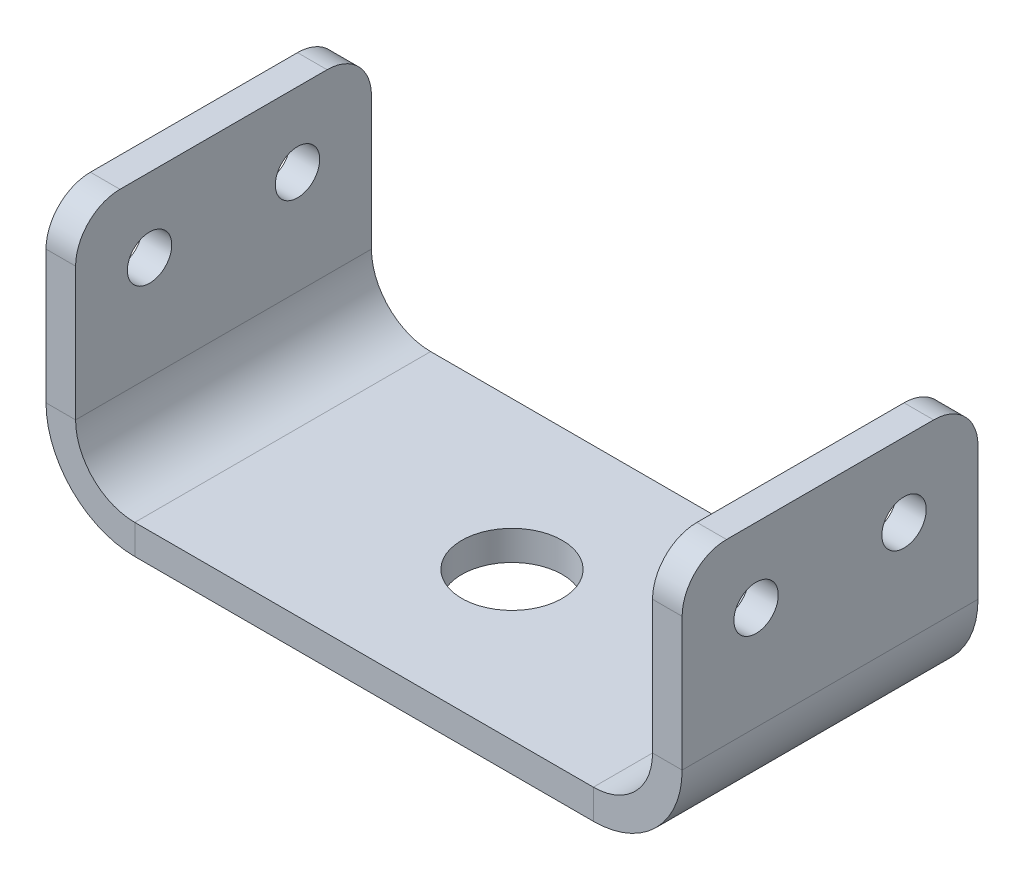
ISO-10303-21;
HEADER;
FILE_DESCRIPTION(('STEP AP214'),'2;1');
FILE_NAME('part.step','',(''),(''),'','','');
FILE_SCHEMA(('AUTOMOTIVE_DESIGN { 1 0 10303 214 1 1 1 1 }'));
ENDSEC;
DATA;
#1=APPLICATION_CONTEXT('core data for automotive mechanical design processes');
#2=APPLICATION_PROTOCOL_DEFINITION('international standard','automotive_design',2000,#1);
#3=PRODUCT_CONTEXT('',#1,'mechanical');
#4=PRODUCT('Part','Part','',(#3));
#5=PRODUCT_RELATED_PRODUCT_CATEGORY('part','',(#4));
#6=PRODUCT_DEFINITION_FORMATION('','',#4);
#7=PRODUCT_DEFINITION_CONTEXT('part definition',#1,'design');
#8=PRODUCT_DEFINITION('design','',#6,#7);
#9=PRODUCT_DEFINITION_SHAPE('','',#8);
#10=(LENGTH_UNIT() NAMED_UNIT(*) SI_UNIT(.MILLI.,.METRE.));
#11=(NAMED_UNIT(*) PLANE_ANGLE_UNIT() SI_UNIT($,.RADIAN.));
#12=(NAMED_UNIT(*) SI_UNIT($,.STERADIAN.) SOLID_ANGLE_UNIT());
#13=UNCERTAINTY_MEASURE_WITH_UNIT(LENGTH_MEASURE(1.E-05),#10,'distance_accuracy_value','');
#14=(GEOMETRIC_REPRESENTATION_CONTEXT(3) GLOBAL_UNCERTAINTY_ASSIGNED_CONTEXT((#13)) GLOBAL_UNIT_ASSIGNED_CONTEXT((#10,
#11,#12)) REPRESENTATION_CONTEXT('',''));
#15=CARTESIAN_POINT('',(0.,0.,0.));
#16=DIRECTION('',(0.,0.,1.));
#17=DIRECTION('',(1.,0.,0.));
#18=AXIS2_PLACEMENT_3D('',#15,#16,#17);
#19=CARTESIAN_POINT('',(21.5,-6.,-10.));
#20=DIRECTION('',(0.,1.,0.));
#21=DIRECTION('',(0.,0.,1.));
#22=AXIS2_PLACEMENT_3D('',#19,#20,#21);
#23=PLANE('',#22);
#24=DIRECTION('',(-1.,0.,0.));
#25=VECTOR('',#24,1.);
#26=CARTESIAN_POINT('',(21.5,-6.,10.));
#27=LINE('',#26,#25);
#28=CARTESIAN_POINT('',(15.5,-6.,10.));
#29=VERTEX_POINT('',#28);
#30=CARTESIAN_POINT('',(-15.5,-6.,10.));
#31=VERTEX_POINT('',#30);
#32=EDGE_CURVE('E129',#29,#31,#27,.T.);
#33=ORIENTED_EDGE('',*,*,#32,.T.);
#34=DIRECTION('',(0.,0.,-1.));
#35=VECTOR('',#34,1.);
#36=CARTESIAN_POINT('',(-15.5,-6.,-10.));
#37=LINE('',#36,#35);
#38=CARTESIAN_POINT('',(-15.5,-6.,-10.));
#39=VERTEX_POINT('',#38);
#40=EDGE_CURVE('E222',#31,#39,#37,.T.);
#41=ORIENTED_EDGE('',*,*,#40,.T.);
#42=DIRECTION('',(-1.,0.,0.));
#43=VECTOR('',#42,1.);
#44=CARTESIAN_POINT('',(21.5,-6.,-10.));
#45=LINE('',#44,#43);
#46=CARTESIAN_POINT('',(15.5,-6.,-10.));
#47=VERTEX_POINT('',#46);
#48=EDGE_CURVE('E338',#47,#39,#45,.T.);
#49=ORIENTED_EDGE('',*,*,#48,.F.);
#50=DIRECTION('',(0.,0.,-1.));
#51=VECTOR('',#50,1.);
#52=CARTESIAN_POINT('',(15.5,-6.,-10.));
#53=LINE('',#52,#51);
#54=EDGE_CURVE('E229',#47,#29,#53,.F.);
#55=ORIENTED_EDGE('',*,*,#54,.T.);
#56=EDGE_LOOP('',(#33,#41,#49,#55));
#57=FACE_BOUND('',#56,.T.);
#58=CARTESIAN_POINT('',(0.,-6.,0.));
#59=DIRECTION('',(0.,1.,0.));
#60=DIRECTION('',(0.,0.,1.));
#61=AXIS2_PLACEMENT_3D('',#58,#59,#60);
#62=CIRCLE('',#61,4.76488561011312);
#63=CARTESIAN_POINT('',(0.,-6.,4.76488561011311));
#64=VERTEX_POINT('',#63);
#65=EDGE_CURVE('E11',#64,#64,#62,.F.);
#66=ORIENTED_EDGE('',*,*,#65,.F.);
#67=EDGE_LOOP('',(#66));
#68=FACE_BOUND('',#67,.T.);
#69=ADVANCED_FACE('F50',(#57,#68),#23,.F.);
#70=CARTESIAN_POINT('',(21.5,-6.,10.));
#71=DIRECTION('',(0.,0.,-1.));
#72=DIRECTION('',(-1.,0.,0.));
#73=AXIS2_PLACEMENT_3D('',#70,#71,#72);
#74=PLANE('',#73);
#75=DIRECTION('',(0.,-1.,0.));
#76=VECTOR('',#75,1.);
#77=CARTESIAN_POINT('',(15.5,-6.,10.));
#78=LINE('',#77,#76);
#79=CARTESIAN_POINT('',(15.5,-4.,10.));
#80=VERTEX_POINT('',#79);
#81=EDGE_CURVE('E60',#80,#29,#78,.T.);
#82=ORIENTED_EDGE('',*,*,#81,.F.);
#83=DIRECTION('',(1.,0.,0.));
#84=VECTOR('',#83,1.);
#85=CARTESIAN_POINT('',(21.5,-4.,10.));
#86=LINE('',#85,#84);
#87=CARTESIAN_POINT('',(-15.5,-4.,10.));
#88=VERTEX_POINT('',#87);
#89=EDGE_CURVE('E126',#80,#88,#86,.F.);
#90=ORIENTED_EDGE('',*,*,#89,.T.);
#91=DIRECTION('',(0.,-1.,0.));
#92=VECTOR('',#91,1.);
#93=CARTESIAN_POINT('',(-15.5,-6.,10.));
#94=LINE('',#93,#92);
#95=EDGE_CURVE('E135',#88,#31,#94,.T.);
#96=ORIENTED_EDGE('',*,*,#95,.T.);
#97=ORIENTED_EDGE('',*,*,#32,.F.);
#98=EDGE_LOOP('',(#82,#90,#96,#97));
#99=FACE_BOUND('',#98,.T.);
#100=ADVANCED_FACE('F123',(#99),#74,.F.);
#101=CARTESIAN_POINT('',(-15.5,0.,10.));
#102=DIRECTION('',(0.,0.,1.));
#103=DIRECTION('',(1.,0.,0.));
#104=AXIS2_PLACEMENT_3D('',#101,#102,#103);
#105=PLANE('',#104);
#106=ORIENTED_EDGE('',*,*,#95,.F.);
#107=CARTESIAN_POINT('',(-15.5,0.,10.));
#108=DIRECTION('',(0.,0.,1.));
#109=DIRECTION('',(0.,-1.,0.));
#110=AXIS2_PLACEMENT_3D('',#107,#108,#109);
#111=CIRCLE('',#110,4.);
#112=CARTESIAN_POINT('',(-19.5,0.,10.));
#113=VERTEX_POINT('',#112);
#114=EDGE_CURVE('E170',#88,#113,#111,.F.);
#115=ORIENTED_EDGE('',*,*,#114,.T.);
#116=DIRECTION('',(-1.,0.,0.));
#117=VECTOR('',#116,1.);
#118=CARTESIAN_POINT('',(-21.5,0.,10.));
#119=LINE('',#118,#117);
#120=CARTESIAN_POINT('',(-21.5,0.,10.));
#121=VERTEX_POINT('',#120);
#122=EDGE_CURVE('E68',#113,#121,#119,.T.);
#123=ORIENTED_EDGE('',*,*,#122,.T.);
#124=CARTESIAN_POINT('',(-15.5,0.,10.));
#125=DIRECTION('',(0.,0.,-1.));
#126=DIRECTION('',(-1.,0.,0.));
#127=AXIS2_PLACEMENT_3D('',#124,#125,#126);
#128=CIRCLE('',#127,6.);
#129=EDGE_CURVE('E236',#31,#121,#128,.T.);
#130=ORIENTED_EDGE('',*,*,#129,.F.);
#131=EDGE_LOOP('',(#106,#115,#123,#130));
#132=FACE_BOUND('',#131,.T.);
#133=ADVANCED_FACE('F281',(#132),#105,.T.);
#134=CARTESIAN_POINT('',(-21.5,0.,10.));
#135=DIRECTION('',(0.,0.,-1.));
#136=DIRECTION('',(0.,-1.,0.));
#137=AXIS2_PLACEMENT_3D('',#134,#135,#136);
#138=PLANE('',#137);
#139=ORIENTED_EDGE('',*,*,#122,.F.);
#140=DIRECTION('',(0.,1.,0.));
#141=VECTOR('',#140,1.);
#142=CARTESIAN_POINT('',(-19.5,0.,10.));
#143=LINE('',#142,#141);
#144=CARTESIAN_POINT('',(-19.5,9.,10.));
#145=VERTEX_POINT('',#144);
#146=EDGE_CURVE('E272',#145,#113,#143,.F.);
#147=ORIENTED_EDGE('',*,*,#146,.F.);
#148=DIRECTION('',(-1.,0.,0.));
#149=VECTOR('',#148,1.);
#150=CARTESIAN_POINT('',(-21.5,9.,10.));
#151=LINE('',#150,#149);
#152=CARTESIAN_POINT('',(-21.5,9.,10.));
#153=VERTEX_POINT('',#152);
#154=EDGE_CURVE('E212',#145,#153,#151,.T.);
#155=ORIENTED_EDGE('',*,*,#154,.T.);
#156=DIRECTION('',(0.,-1.,0.));
#157=VECTOR('',#156,1.);
#158=CARTESIAN_POINT('',(-21.5,0.,10.));
#159=LINE('',#158,#157);
#160=EDGE_CURVE('E295',#153,#121,#159,.T.);
#161=ORIENTED_EDGE('',*,*,#160,.T.);
#162=EDGE_LOOP('',(#139,#147,#155,#161));
#163=FACE_BOUND('',#162,.T.);
#164=ADVANCED_FACE('F292',(#163),#138,.F.);
#165=CARTESIAN_POINT('',(-21.5,9.,7.));
#166=DIRECTION('',(-1.,0.,0.));
#167=DIRECTION('',(0.,0.,1.));
#168=AXIS2_PLACEMENT_3D('',#165,#166,#167);
#169=CYLINDRICAL_SURFACE('',#168,3.);
#170=ORIENTED_EDGE('',*,*,#154,.F.);
#171=CARTESIAN_POINT('',(-19.5,9.,7.));
#172=DIRECTION('',(-1.,0.,0.));
#173=DIRECTION('',(0.,0.,1.));
#174=AXIS2_PLACEMENT_3D('',#171,#172,#173);
#175=CIRCLE('',#174,3.);
#176=CARTESIAN_POINT('',(-19.5,12.,7.));
#177=VERTEX_POINT('',#176);
#178=EDGE_CURVE('E249',#145,#177,#175,.T.);
#179=ORIENTED_EDGE('',*,*,#178,.T.);
#180=DIRECTION('',(-1.,0.,0.));
#181=VECTOR('',#180,1.);
#182=CARTESIAN_POINT('',(-21.5,12.,7.));
#183=LINE('',#182,#181);
#184=CARTESIAN_POINT('',(-21.5,12.,7.));
#185=VERTEX_POINT('',#184);
#186=EDGE_CURVE('E209',#177,#185,#183,.T.);
#187=ORIENTED_EDGE('',*,*,#186,.T.);
#188=CARTESIAN_POINT('',(-21.5,9.,7.));
#189=DIRECTION('',(-1.,0.,0.));
#190=DIRECTION('',(0.,0.,1.));
#191=AXIS2_PLACEMENT_3D('',#188,#189,#190);
#192=CIRCLE('',#191,3.);
#193=EDGE_CURVE('E298',#153,#185,#192,.T.);
#194=ORIENTED_EDGE('',*,*,#193,.F.);
#195=EDGE_LOOP('',(#170,#179,#187,#194));
#196=FACE_BOUND('',#195,.T.);
#197=ADVANCED_FACE('F395',(#196),#169,.T.);
#198=CARTESIAN_POINT('',(-21.5,12.,-10.));
#199=DIRECTION('',(0.,-1.,0.));
#200=DIRECTION('',(0.,0.,1.));
#201=AXIS2_PLACEMENT_3D('',#198,#199,#200);
#202=PLANE('',#201);
#203=ORIENTED_EDGE('',*,*,#186,.F.);
#204=DIRECTION('',(0.,0.,1.));
#205=VECTOR('',#204,1.);
#206=CARTESIAN_POINT('',(-19.5,12.,0.));
#207=LINE('',#206,#205);
#208=CARTESIAN_POINT('',(-19.5,12.,-6.99999999999999));
#209=VERTEX_POINT('',#208);
#210=EDGE_CURVE('E179',#209,#177,#207,.T.);
#211=ORIENTED_EDGE('',*,*,#210,.F.);
#212=DIRECTION('',(-1.,0.,0.));
#213=VECTOR('',#212,1.);
#214=CARTESIAN_POINT('',(-21.5,12.,-6.99999999999999));
#215=LINE('',#214,#213);
#216=CARTESIAN_POINT('',(-21.5,12.,-6.99999999999999));
#217=VERTEX_POINT('',#216);
#218=EDGE_CURVE('E206',#209,#217,#215,.T.);
#219=ORIENTED_EDGE('',*,*,#218,.T.);
#220=DIRECTION('',(0.,0.,1.));
#221=VECTOR('',#220,1.);
#222=CARTESIAN_POINT('',(-21.5,12.,-10.));
#223=LINE('',#222,#221);
#224=EDGE_CURVE('E352',#217,#185,#223,.T.);
#225=ORIENTED_EDGE('',*,*,#224,.T.);
#226=EDGE_LOOP('',(#203,#211,#219,#225));
#227=FACE_BOUND('',#226,.T.);
#228=ADVANCED_FACE('F391',(#227),#202,.F.);
#229=CARTESIAN_POINT('',(-21.5,9.,-6.99999999999999));
#230=DIRECTION('',(-1.,0.,0.));
#231=DIRECTION('',(0.,0.,1.));
#232=AXIS2_PLACEMENT_3D('',#229,#230,#231);
#233=CYLINDRICAL_SURFACE('',#232,3.);
#234=ORIENTED_EDGE('',*,*,#218,.F.);
#235=CARTESIAN_POINT('',(-19.5,9.,-6.99999999999999));
#236=DIRECTION('',(-1.,0.,0.));
#237=DIRECTION('',(0.,0.,1.));
#238=AXIS2_PLACEMENT_3D('',#235,#236,#237);
#239=CIRCLE('',#238,3.);
#240=CARTESIAN_POINT('',(-19.5,9.,-9.99999999999999));
#241=VERTEX_POINT('',#240);
#242=EDGE_CURVE('E273',#209,#241,#239,.T.);
#243=ORIENTED_EDGE('',*,*,#242,.T.);
#244=DIRECTION('',(-1.,0.,0.));
#245=VECTOR('',#244,1.);
#246=CARTESIAN_POINT('',(-21.5,9.,-9.99999999999999));
#247=LINE('',#246,#245);
#248=CARTESIAN_POINT('',(-21.5,9.,-9.99999999999999));
#249=VERTEX_POINT('',#248);
#250=EDGE_CURVE('E203',#241,#249,#247,.T.);
#251=ORIENTED_EDGE('',*,*,#250,.T.);
#252=CARTESIAN_POINT('',(-21.5,9.,-6.99999999999999));
#253=DIRECTION('',(-1.,0.,0.));
#254=DIRECTION('',(0.,0.,1.));
#255=AXIS2_PLACEMENT_3D('',#252,#253,#254);
#256=CIRCLE('',#255,3.);
#257=EDGE_CURVE('E304',#217,#249,#256,.T.);
#258=ORIENTED_EDGE('',*,*,#257,.F.);
#259=EDGE_LOOP('',(#234,#243,#251,#258));
#260=FACE_BOUND('',#259,.T.);
#261=ADVANCED_FACE('F393',(#260),#233,.T.);
#262=CARTESIAN_POINT('',(-21.5,0.,-10.));
#263=DIRECTION('',(0.,0.,1.));
#264=DIRECTION('',(0.,1.,0.));
#265=AXIS2_PLACEMENT_3D('',#262,#263,#264);
#266=PLANE('',#265);
#267=ORIENTED_EDGE('',*,*,#250,.F.);
#268=DIRECTION('',(0.,1.,0.));
#269=VECTOR('',#268,1.);
#270=CARTESIAN_POINT('',(-19.5,0.,-10.));
#271=LINE('',#270,#269);
#272=CARTESIAN_POINT('',(-19.5,0.,-10.));
#273=VERTEX_POINT('',#272);
#274=EDGE_CURVE('E269',#273,#241,#271,.T.);
#275=ORIENTED_EDGE('',*,*,#274,.F.);
#276=DIRECTION('',(-1.,0.,0.));
#277=VECTOR('',#276,1.);
#278=CARTESIAN_POINT('',(-21.5,0.,-10.));
#279=LINE('',#278,#277);
#280=CARTESIAN_POINT('',(-21.5,0.,-10.));
#281=VERTEX_POINT('',#280);
#282=EDGE_CURVE('E201',#273,#281,#279,.T.);
#283=ORIENTED_EDGE('',*,*,#282,.T.);
#284=DIRECTION('',(0.,1.,0.));
#285=VECTOR('',#284,1.);
#286=CARTESIAN_POINT('',(-21.5,0.,-10.));
#287=LINE('',#286,#285);
#288=EDGE_CURVE('E299',#281,#249,#287,.T.);
#289=ORIENTED_EDGE('',*,*,#288,.T.);
#290=EDGE_LOOP('',(#267,#275,#283,#289));
#291=FACE_BOUND('',#290,.T.);
#292=ADVANCED_FACE('F363',(#291),#266,.F.);
#293=CARTESIAN_POINT('',(-15.5,0.,-10.));
#294=DIRECTION('',(0.,0.,1.));
#295=DIRECTION('',(0.,-1.,0.));
#296=AXIS2_PLACEMENT_3D('',#293,#294,#295);
#297=PLANE('',#296);
#298=ORIENTED_EDGE('',*,*,#282,.F.);
#299=CARTESIAN_POINT('',(-15.5,0.,-10.));
#300=DIRECTION('',(0.,0.,1.));
#301=DIRECTION('',(0.,-1.,0.));
#302=AXIS2_PLACEMENT_3D('',#299,#300,#301);
#303=CIRCLE('',#302,4.);
#304=CARTESIAN_POINT('',(-15.5,-4.,-10.));
#305=VERTEX_POINT('',#304);
#306=EDGE_CURVE('E266',#273,#305,#303,.T.);
#307=ORIENTED_EDGE('',*,*,#306,.T.);
#308=DIRECTION('',(0.,-1.,0.));
#309=VECTOR('',#308,1.);
#310=CARTESIAN_POINT('',(-15.5,-6.,-10.));
#311=LINE('',#310,#309);
#312=EDGE_CURVE('E198',#305,#39,#311,.T.);
#313=ORIENTED_EDGE('',*,*,#312,.T.);
#314=CARTESIAN_POINT('',(-15.5,0.,-10.));
#315=DIRECTION('',(0.,0.,-1.));
#316=DIRECTION('',(0.,1.,0.));
#317=AXIS2_PLACEMENT_3D('',#314,#315,#316);
#318=CIRCLE('',#317,6.);
#319=EDGE_CURVE('E233',#281,#39,#318,.F.);
#320=ORIENTED_EDGE('',*,*,#319,.F.);
#321=EDGE_LOOP('',(#298,#307,#313,#320));
#322=FACE_BOUND('',#321,.T.);
#323=ADVANCED_FACE('F365',(#322),#297,.F.);
#324=CARTESIAN_POINT('',(21.5,-6.,-10.));
#325=DIRECTION('',(0.,0.,-1.));
#326=DIRECTION('',(-1.,0.,0.));
#327=AXIS2_PLACEMENT_3D('',#324,#325,#326);
#328=PLANE('',#327);
#329=ORIENTED_EDGE('',*,*,#312,.F.);
#330=DIRECTION('',(1.,0.,0.));
#331=VECTOR('',#330,1.);
#332=CARTESIAN_POINT('',(21.5,-4.,-10.));
#333=LINE('',#332,#331);
#334=CARTESIAN_POINT('',(15.5,-4.,-10.));
#335=VERTEX_POINT('',#334);
#336=EDGE_CURVE('E159',#335,#305,#333,.F.);
#337=ORIENTED_EDGE('',*,*,#336,.F.);
#338=DIRECTION('',(0.,-1.,0.));
#339=VECTOR('',#338,1.);
#340=CARTESIAN_POINT('',(15.5,-6.,-10.));
#341=LINE('',#340,#339);
#342=EDGE_CURVE('E195',#335,#47,#341,.T.);
#343=ORIENTED_EDGE('',*,*,#342,.T.);
#344=ORIENTED_EDGE('',*,*,#48,.T.);
#345=EDGE_LOOP('',(#329,#337,#343,#344));
#346=FACE_BOUND('',#345,.T.);
#347=ADVANCED_FACE('F482',(#346),#328,.T.);
#348=CARTESIAN_POINT('',(15.5,0.,-10.));
#349=DIRECTION('',(0.,0.,-1.));
#350=DIRECTION('',(0.,1.,0.));
#351=AXIS2_PLACEMENT_3D('',#348,#349,#350);
#352=PLANE('',#351);
#353=ORIENTED_EDGE('',*,*,#342,.F.);
#354=CARTESIAN_POINT('',(15.5,0.,-10.));
#355=DIRECTION('',(0.,0.,-1.));
#356=DIRECTION('',(0.,1.,0.));
#357=AXIS2_PLACEMENT_3D('',#354,#355,#356);
#358=CIRCLE('',#357,4.);
#359=CARTESIAN_POINT('',(19.5,0.,-10.));
#360=VERTEX_POINT('',#359);
#361=EDGE_CURVE('E147',#335,#360,#358,.F.);
#362=ORIENTED_EDGE('',*,*,#361,.T.);
#363=DIRECTION('',(1.,0.,0.));
#364=VECTOR('',#363,1.);
#365=CARTESIAN_POINT('',(21.5,0.,-10.));
#366=LINE('',#365,#364);
#367=CARTESIAN_POINT('',(21.5,0.,-10.));
#368=VERTEX_POINT('',#367);
#369=EDGE_CURVE('E192',#360,#368,#366,.T.);
#370=ORIENTED_EDGE('',*,*,#369,.T.);
#371=CARTESIAN_POINT('',(15.5,0.,-10.));
#372=DIRECTION('',(0.,0.,1.));
#373=DIRECTION('',(0.,-1.,0.));
#374=AXIS2_PLACEMENT_3D('',#371,#372,#373);
#375=CIRCLE('',#374,6.);
#376=EDGE_CURVE('E239',#47,#368,#375,.T.);
#377=ORIENTED_EDGE('',*,*,#376,.F.);
#378=EDGE_LOOP('',(#353,#362,#370,#377));
#379=FACE_BOUND('',#378,.T.);
#380=ADVANCED_FACE('F478',(#379),#352,.T.);
#381=CARTESIAN_POINT('',(21.5,0.,-10.));
#382=DIRECTION('',(0.,0.,1.));
#383=DIRECTION('',(0.,1.,0.));
#384=AXIS2_PLACEMENT_3D('',#381,#382,#383);
#385=PLANE('',#384);
#386=ORIENTED_EDGE('',*,*,#369,.F.);
#387=DIRECTION('',(0.,1.,0.));
#388=VECTOR('',#387,1.);
#389=CARTESIAN_POINT('',(19.5,0.,-10.));
#390=LINE('',#389,#388);
#391=CARTESIAN_POINT('',(19.5,9.,-9.99999999999999));
#392=VERTEX_POINT('',#391);
#393=EDGE_CURVE('E255',#360,#392,#390,.T.);
#394=ORIENTED_EDGE('',*,*,#393,.T.);
#395=DIRECTION('',(1.,0.,0.));
#396=VECTOR('',#395,1.);
#397=CARTESIAN_POINT('',(21.5,9.,-9.99999999999999));
#398=LINE('',#397,#396);
#399=CARTESIAN_POINT('',(21.5,9.,-9.99999999999999));
#400=VERTEX_POINT('',#399);
#401=EDGE_CURVE('E189',#392,#400,#398,.T.);
#402=ORIENTED_EDGE('',*,*,#401,.T.);
#403=DIRECTION('',(0.,1.,0.));
#404=VECTOR('',#403,1.);
#405=CARTESIAN_POINT('',(21.5,0.,-10.));
#406=LINE('',#405,#404);
#407=EDGE_CURVE('E321',#368,#400,#406,.T.);
#408=ORIENTED_EDGE('',*,*,#407,.F.);
#409=EDGE_LOOP('',(#386,#394,#402,#408));
#410=FACE_BOUND('',#409,.T.);
#411=ADVANCED_FACE('F474',(#410),#385,.F.);
#412=CARTESIAN_POINT('',(21.5,9.,-6.99999999999999));
#413=DIRECTION('',(-1.,0.,0.));
#414=DIRECTION('',(0.,0.,1.));
#415=AXIS2_PLACEMENT_3D('',#412,#413,#414);
#416=CYLINDRICAL_SURFACE('',#415,3.);
#417=ORIENTED_EDGE('',*,*,#401,.F.);
#418=CARTESIAN_POINT('',(19.5,9.,-6.99999999999999));
#419=DIRECTION('',(-1.,0.,0.));
#420=DIRECTION('',(0.,0.,1.));
#421=AXIS2_PLACEMENT_3D('',#418,#419,#420);
#422=CIRCLE('',#421,3.);
#423=CARTESIAN_POINT('',(19.5,12.,-6.99999999999999));
#424=VERTEX_POINT('',#423);
#425=EDGE_CURVE('E240',#392,#424,#422,.F.);
#426=ORIENTED_EDGE('',*,*,#425,.T.);
#427=DIRECTION('',(1.,0.,0.));
#428=VECTOR('',#427,1.);
#429=CARTESIAN_POINT('',(21.5,12.,-6.99999999999999));
#430=LINE('',#429,#428);
#431=CARTESIAN_POINT('',(21.5,12.,-6.99999999999999));
#432=VERTEX_POINT('',#431);
#433=EDGE_CURVE('E186',#424,#432,#430,.T.);
#434=ORIENTED_EDGE('',*,*,#433,.T.);
#435=CARTESIAN_POINT('',(21.5,9.,-6.99999999999999));
#436=DIRECTION('',(-1.,0.,0.));
#437=DIRECTION('',(0.,0.,1.));
#438=AXIS2_PLACEMENT_3D('',#435,#436,#437);
#439=CIRCLE('',#438,3.);
#440=EDGE_CURVE('E324',#400,#432,#439,.F.);
#441=ORIENTED_EDGE('',*,*,#440,.F.);
#442=EDGE_LOOP('',(#417,#426,#434,#441));
#443=FACE_BOUND('',#442,.T.);
#444=ADVANCED_FACE('F470',(#443),#416,.T.);
#445=CARTESIAN_POINT('',(21.5,12.,-10.));
#446=DIRECTION('',(0.,1.,0.));
#447=DIRECTION('',(0.,0.,-1.));
#448=AXIS2_PLACEMENT_3D('',#445,#446,#447);
#449=PLANE('',#448);
#450=ORIENTED_EDGE('',*,*,#433,.F.);
#451=DIRECTION('',(0.,0.,1.));
#452=VECTOR('',#451,1.);
#453=CARTESIAN_POINT('',(19.5,12.,0.));
#454=LINE('',#453,#452);
#455=CARTESIAN_POINT('',(19.5,12.,7.));
#456=VERTEX_POINT('',#455);
#457=EDGE_CURVE('E252',#456,#424,#454,.F.);
#458=ORIENTED_EDGE('',*,*,#457,.F.);
#459=DIRECTION('',(1.,0.,0.));
#460=VECTOR('',#459,1.);
#461=CARTESIAN_POINT('',(21.5,12.,7.));
#462=LINE('',#461,#460);
#463=CARTESIAN_POINT('',(21.5,12.,7.));
#464=VERTEX_POINT('',#463);
#465=EDGE_CURVE('E183',#456,#464,#462,.T.);
#466=ORIENTED_EDGE('',*,*,#465,.T.);
#467=DIRECTION('',(0.,0.,-1.));
#468=VECTOR('',#467,1.);
#469=CARTESIAN_POINT('',(21.5,12.,-10.));
#470=LINE('',#469,#468);
#471=EDGE_CURVE('E313',#464,#432,#470,.T.);
#472=ORIENTED_EDGE('',*,*,#471,.T.);
#473=EDGE_LOOP('',(#450,#458,#466,#472));
#474=FACE_BOUND('',#473,.T.);
#475=ADVANCED_FACE('F466',(#474),#449,.T.);
#476=CARTESIAN_POINT('',(21.5,9.,7.));
#477=DIRECTION('',(-1.,0.,0.));
#478=DIRECTION('',(0.,0.,1.));
#479=AXIS2_PLACEMENT_3D('',#476,#477,#478);
#480=CYLINDRICAL_SURFACE('',#479,3.);
#481=ORIENTED_EDGE('',*,*,#465,.F.);
#482=CARTESIAN_POINT('',(19.5,9.,7.));
#483=DIRECTION('',(-1.,0.,0.));
#484=DIRECTION('',(0.,0.,1.));
#485=AXIS2_PLACEMENT_3D('',#482,#483,#484);
#486=CIRCLE('',#485,3.);
#487=CARTESIAN_POINT('',(19.5,9.,10.));
#488=VERTEX_POINT('',#487);
#489=EDGE_CURVE('E256',#456,#488,#486,.F.);
#490=ORIENTED_EDGE('',*,*,#489,.T.);
#491=DIRECTION('',(1.,0.,0.));
#492=VECTOR('',#491,1.);
#493=CARTESIAN_POINT('',(21.5,9.,10.));
#494=LINE('',#493,#492);
#495=CARTESIAN_POINT('',(21.5,9.,10.));
#496=VERTEX_POINT('',#495);
#497=EDGE_CURVE('E180',#488,#496,#494,.T.);
#498=ORIENTED_EDGE('',*,*,#497,.T.);
#499=CARTESIAN_POINT('',(21.5,9.,7.));
#500=DIRECTION('',(-1.,0.,0.));
#501=DIRECTION('',(0.,0.,1.));
#502=AXIS2_PLACEMENT_3D('',#499,#500,#501);
#503=CIRCLE('',#502,3.);
#504=EDGE_CURVE('E316',#464,#496,#503,.F.);
#505=ORIENTED_EDGE('',*,*,#504,.F.);
#506=EDGE_LOOP('',(#481,#490,#498,#505));
#507=FACE_BOUND('',#506,.T.);
#508=ADVANCED_FACE('F463',(#507),#480,.T.);
#509=CARTESIAN_POINT('',(21.5,0.,10.));
#510=DIRECTION('',(0.,0.,-1.));
#511=DIRECTION('',(0.,-1.,0.));
#512=AXIS2_PLACEMENT_3D('',#509,#510,#511);
#513=PLANE('',#512);
#514=ORIENTED_EDGE('',*,*,#497,.F.);
#515=DIRECTION('',(0.,1.,0.));
#516=VECTOR('',#515,1.);
#517=CARTESIAN_POINT('',(19.5,0.,10.));
#518=LINE('',#517,#516);
#519=CARTESIAN_POINT('',(19.5,0.,10.));
#520=VERTEX_POINT('',#519);
#521=EDGE_CURVE('E253',#488,#520,#518,.F.);
#522=ORIENTED_EDGE('',*,*,#521,.T.);
#523=DIRECTION('',(1.,0.,0.));
#524=VECTOR('',#523,1.);
#525=CARTESIAN_POINT('',(21.5,0.,10.));
#526=LINE('',#525,#524);
#527=CARTESIAN_POINT('',(21.5,0.,10.));
#528=VERTEX_POINT('',#527);
#529=EDGE_CURVE('E164',#520,#528,#526,.T.);
#530=ORIENTED_EDGE('',*,*,#529,.T.);
#531=DIRECTION('',(0.,-1.,0.));
#532=VECTOR('',#531,1.);
#533=CARTESIAN_POINT('',(21.5,0.,10.));
#534=LINE('',#533,#532);
#535=EDGE_CURVE('E319',#496,#528,#534,.T.);
#536=ORIENTED_EDGE('',*,*,#535,.F.);
#537=EDGE_LOOP('',(#514,#522,#530,#536));
#538=FACE_BOUND('',#537,.T.);
#539=ADVANCED_FACE('F459',(#538),#513,.F.);
#540=CARTESIAN_POINT('',(0.,-6.,0.));
#541=DIRECTION('',(0.,1.,0.));
#542=DIRECTION('',(0.,0.,1.));
#543=AXIS2_PLACEMENT_3D('',#540,#541,#542);
#544=CYLINDRICAL_SURFACE('',#543,3.4);
#545=CARTESIAN_POINT('',(0.,-6.,0.));
#546=DIRECTION('',(0.,-1.,0.));
#547=DIRECTION('',(0.,0.,-1.));
#548=AXIS2_PLACEMENT_3D('',#545,#546,#547);
#549=CIRCLE('',#548,3.4);
#550=CARTESIAN_POINT('',(0.,-6.,-3.4));
#551=VERTEX_POINT('',#550);
#552=EDGE_CURVE('E333',#551,#551,#549,.T.);
#553=ORIENTED_EDGE('',*,*,#552,.T.);
#554=EDGE_LOOP('',(#553));
#555=FACE_BOUND('',#554,.T.);
#556=CARTESIAN_POINT('',(0.,-4.,0.));
#557=DIRECTION('',(0.,-1.,0.));
#558=DIRECTION('',(0.,0.,-1.));
#559=AXIS2_PLACEMENT_3D('',#556,#557,#558);
#560=CIRCLE('',#559,3.4);
#561=CARTESIAN_POINT('',(0.,-4.,-3.4));
#562=VERTEX_POINT('',#561);
#563=EDGE_CURVE('E166',#562,#562,#560,.T.);
#564=ORIENTED_EDGE('',*,*,#563,.F.);
#565=EDGE_LOOP('',(#564));
#566=FACE_BOUND('',#565,.T.);
#567=ADVANCED_FACE('F462',(#555,#566),#544,.F.);
#568=CARTESIAN_POINT('',(-21.5,7.,-5.));
#569=DIRECTION('',(-1.,0.,0.));
#570=DIRECTION('',(0.,0.,1.));
#571=AXIS2_PLACEMENT_3D('',#568,#569,#570);
#572=CYLINDRICAL_SURFACE('',#571,1.5);
#573=CARTESIAN_POINT('',(-21.5,7.,-5.));
#574=DIRECTION('',(-1.,0.,0.));
#575=DIRECTION('',(0.,0.,1.));
#576=AXIS2_PLACEMENT_3D('',#573,#574,#575);
#577=CIRCLE('',#576,1.5);
#578=CARTESIAN_POINT('',(-21.5,7.,-3.5));
#579=VERTEX_POINT('',#578);
#580=EDGE_CURVE('E346',#579,#579,#577,.T.);
#581=ORIENTED_EDGE('',*,*,#580,.T.);
#582=EDGE_LOOP('',(#581));
#583=FACE_BOUND('',#582,.T.);
#584=CARTESIAN_POINT('',(-19.5,7.,-5.));
#585=DIRECTION('',(-1.,0.,0.));
#586=DIRECTION('',(0.,0.,1.));
#587=AXIS2_PLACEMENT_3D('',#584,#585,#586);
#588=CIRCLE('',#587,1.5);
#589=CARTESIAN_POINT('',(-19.5,7.,-3.5));
#590=VERTEX_POINT('',#589);
#591=EDGE_CURVE('E158',#590,#590,#588,.T.);
#592=ORIENTED_EDGE('',*,*,#591,.F.);
#593=EDGE_LOOP('',(#592));
#594=FACE_BOUND('',#593,.T.);
#595=ADVANCED_FACE('F538',(#583,#594),#572,.F.);
#596=CARTESIAN_POINT('',(-21.5,7.,5.));
#597=DIRECTION('',(-1.,0.,0.));
#598=DIRECTION('',(0.,0.,1.));
#599=AXIS2_PLACEMENT_3D('',#596,#597,#598);
#600=CYLINDRICAL_SURFACE('',#599,1.5);
#601=CARTESIAN_POINT('',(-21.5,7.,5.));
#602=DIRECTION('',(-1.,0.,0.));
#603=DIRECTION('',(0.,0.,1.));
#604=AXIS2_PLACEMENT_3D('',#601,#602,#603);
#605=CIRCLE('',#604,1.5);
#606=CARTESIAN_POINT('',(-21.5,7.,6.5));
#607=VERTEX_POINT('',#606);
#608=EDGE_CURVE('E349',#607,#607,#605,.T.);
#609=ORIENTED_EDGE('',*,*,#608,.T.);
#610=EDGE_LOOP('',(#609));
#611=FACE_BOUND('',#610,.T.);
#612=CARTESIAN_POINT('',(-19.5,7.,5.));
#613=DIRECTION('',(-1.,0.,0.));
#614=DIRECTION('',(0.,0.,1.));
#615=AXIS2_PLACEMENT_3D('',#612,#613,#614);
#616=CIRCLE('',#615,1.5);
#617=CARTESIAN_POINT('',(-19.5,7.,6.5));
#618=VERTEX_POINT('',#617);
#619=EDGE_CURVE('E176',#618,#618,#616,.T.);
#620=ORIENTED_EDGE('',*,*,#619,.F.);
#621=EDGE_LOOP('',(#620));
#622=FACE_BOUND('',#621,.T.);
#623=ADVANCED_FACE('F52',(#611,#622),#600,.F.);
#624=CARTESIAN_POINT('',(21.5,7.,-5.));
#625=DIRECTION('',(-1.,0.,0.));
#626=DIRECTION('',(0.,0.,1.));
#627=AXIS2_PLACEMENT_3D('',#624,#625,#626);
#628=CYLINDRICAL_SURFACE('',#627,1.5);
#629=CARTESIAN_POINT('',(21.5,7.,-5.));
#630=DIRECTION('',(-1.,0.,0.));
#631=DIRECTION('',(0.,0.,1.));
#632=AXIS2_PLACEMENT_3D('',#629,#630,#631);
#633=CIRCLE('',#632,1.5);
#634=CARTESIAN_POINT('',(21.5,7.,-3.5));
#635=VERTEX_POINT('',#634);
#636=EDGE_CURVE('E301',#635,#635,#633,.T.);
#637=ORIENTED_EDGE('',*,*,#636,.F.);
#638=EDGE_LOOP('',(#637));
#639=FACE_BOUND('',#638,.T.);
#640=CARTESIAN_POINT('',(19.5,7.,-5.));
#641=DIRECTION('',(-1.,0.,0.));
#642=DIRECTION('',(0.,0.,1.));
#643=AXIS2_PLACEMENT_3D('',#640,#641,#642);
#644=CIRCLE('',#643,1.5);
#645=CARTESIAN_POINT('',(19.5,7.,-3.5));
#646=VERTEX_POINT('',#645);
#647=EDGE_CURVE('E245',#646,#646,#644,.T.);
#648=ORIENTED_EDGE('',*,*,#647,.T.);
#649=EDGE_LOOP('',(#648));
#650=FACE_BOUND('',#649,.T.);
#651=ADVANCED_FACE('F451',(#639,#650),#628,.F.);
#652=CARTESIAN_POINT('',(21.5,7.,5.));
#653=DIRECTION('',(-1.,0.,0.));
#654=DIRECTION('',(0.,0.,1.));
#655=AXIS2_PLACEMENT_3D('',#652,#653,#654);
#656=CYLINDRICAL_SURFACE('',#655,1.5);
#657=CARTESIAN_POINT('',(21.5,7.,5.));
#658=DIRECTION('',(-1.,0.,0.));
#659=DIRECTION('',(0.,0.,1.));
#660=AXIS2_PLACEMENT_3D('',#657,#658,#659);
#661=CIRCLE('',#660,1.5);
#662=CARTESIAN_POINT('',(21.5,7.,6.5));
#663=VERTEX_POINT('',#662);
#664=EDGE_CURVE('E310',#663,#663,#661,.T.);
#665=ORIENTED_EDGE('',*,*,#664,.F.);
#666=EDGE_LOOP('',(#665));
#667=FACE_BOUND('',#666,.T.);
#668=CARTESIAN_POINT('',(19.5,7.,5.));
#669=DIRECTION('',(-1.,0.,0.));
#670=DIRECTION('',(0.,0.,1.));
#671=AXIS2_PLACEMENT_3D('',#668,#669,#670);
#672=CIRCLE('',#671,1.5);
#673=CARTESIAN_POINT('',(19.5,7.,6.5));
#674=VERTEX_POINT('',#673);
#675=EDGE_CURVE('E248',#674,#674,#672,.T.);
#676=ORIENTED_EDGE('',*,*,#675,.T.);
#677=EDGE_LOOP('',(#676));
#678=FACE_BOUND('',#677,.T.);
#679=ADVANCED_FACE('F454',(#667,#678),#656,.F.);
#680=CARTESIAN_POINT('',(15.5,0.,10.));
#681=DIRECTION('',(0.,0.,-1.));
#682=DIRECTION('',(-1.,0.,0.));
#683=AXIS2_PLACEMENT_3D('',#680,#681,#682);
#684=PLANE('',#683);
#685=CARTESIAN_POINT('',(15.5,0.,10.));
#686=DIRECTION('',(0.,0.,-1.));
#687=DIRECTION('',(0.,1.,0.));
#688=AXIS2_PLACEMENT_3D('',#685,#686,#687);
#689=CIRCLE('',#688,4.);
#690=EDGE_CURVE('E144',#520,#80,#689,.T.);
#691=ORIENTED_EDGE('',*,*,#690,.T.);
#692=ORIENTED_EDGE('',*,*,#81,.T.);
#693=CARTESIAN_POINT('',(15.5,0.,10.));
#694=DIRECTION('',(0.,0.,1.));
#695=DIRECTION('',(1.,0.,0.));
#696=AXIS2_PLACEMENT_3D('',#693,#694,#695);
#697=CIRCLE('',#696,6.);
#698=EDGE_CURVE('E332',#528,#29,#697,.F.);
#699=ORIENTED_EDGE('',*,*,#698,.F.);
#700=ORIENTED_EDGE('',*,*,#529,.F.);
#701=EDGE_LOOP('',(#691,#692,#699,#700));
#702=FACE_BOUND('',#701,.T.);
#703=ADVANCED_FACE('F162',(#702),#684,.F.);
#704=CARTESIAN_POINT('',(21.5,0.,0.));
#705=DIRECTION('',(-1.,0.,0.));
#706=DIRECTION('',(0.,0.,1.));
#707=AXIS2_PLACEMENT_3D('',#704,#705,#706);
#708=PLANE('',#707);
#709=ORIENTED_EDGE('',*,*,#636,.T.);
#710=EDGE_LOOP('',(#709));
#711=FACE_BOUND('',#710,.T.);
#712=ORIENTED_EDGE('',*,*,#664,.T.);
#713=EDGE_LOOP('',(#712));
#714=FACE_BOUND('',#713,.T.);
#715=ORIENTED_EDGE('',*,*,#535,.T.);
#716=DIRECTION('',(0.,0.,-1.));
#717=VECTOR('',#716,1.);
#718=CARTESIAN_POINT('',(21.5,0.,0.));
#719=LINE('',#718,#717);
#720=EDGE_CURVE('E327',#528,#368,#719,.T.);
#721=ORIENTED_EDGE('',*,*,#720,.T.);
#722=ORIENTED_EDGE('',*,*,#407,.T.);
#723=ORIENTED_EDGE('',*,*,#440,.T.);
#724=ORIENTED_EDGE('',*,*,#471,.F.);
#725=ORIENTED_EDGE('',*,*,#504,.T.);
#726=EDGE_LOOP('',(#715,#721,#722,#723,#724,#725));
#727=FACE_BOUND('',#726,.T.);
#728=ADVANCED_FACE('F422',(#711,#714,#727),#708,.F.);
#729=CARTESIAN_POINT('',(-21.5,0.,0.));
#730=DIRECTION('',(-1.,0.,0.));
#731=DIRECTION('',(0.,0.,1.));
#732=AXIS2_PLACEMENT_3D('',#729,#730,#731);
#733=PLANE('',#732);
#734=ORIENTED_EDGE('',*,*,#580,.F.);
#735=EDGE_LOOP('',(#734));
#736=FACE_BOUND('',#735,.T.);
#737=ORIENTED_EDGE('',*,*,#608,.F.);
#738=EDGE_LOOP('',(#737));
#739=FACE_BOUND('',#738,.T.);
#740=ORIENTED_EDGE('',*,*,#288,.F.);
#741=DIRECTION('',(0.,0.,-1.));
#742=VECTOR('',#741,1.);
#743=CARTESIAN_POINT('',(-21.5,0.,10.));
#744=LINE('',#743,#742);
#745=EDGE_CURVE('E216',#281,#121,#744,.F.);
#746=ORIENTED_EDGE('',*,*,#745,.T.);
#747=ORIENTED_EDGE('',*,*,#160,.F.);
#748=ORIENTED_EDGE('',*,*,#193,.T.);
#749=ORIENTED_EDGE('',*,*,#224,.F.);
#750=ORIENTED_EDGE('',*,*,#257,.T.);
#751=EDGE_LOOP('',(#740,#746,#747,#748,#749,#750));
#752=FACE_BOUND('',#751,.T.);
#753=ADVANCED_FACE('F358',(#736,#739,#752),#733,.T.);
#754=ORIENTED_EDGE('',*,*,#65,.T.);
#755=EDGE_LOOP('',(#754));
#756=FACE_BOUND('',#755,.T.);
#757=ORIENTED_EDGE('',*,*,#552,.F.);
#758=EDGE_LOOP('',(#757));
#759=FACE_BOUND('',#758,.T.);
#760=ADVANCED_FACE('F407',(#756,#759),#23,.F.);
#761=CARTESIAN_POINT('',(15.5,0.,0.));
#762=DIRECTION('',(0.,0.,-1.));
#763=DIRECTION('',(0.,1.,0.));
#764=AXIS2_PLACEMENT_3D('',#761,#762,#763);
#765=CYLINDRICAL_SURFACE('',#764,6.);
#766=ORIENTED_EDGE('',*,*,#698,.T.);
#767=ORIENTED_EDGE('',*,*,#54,.F.);
#768=ORIENTED_EDGE('',*,*,#376,.T.);
#769=ORIENTED_EDGE('',*,*,#720,.F.);
#770=EDGE_LOOP('',(#766,#767,#768,#769));
#771=FACE_BOUND('',#770,.T.);
#772=ADVANCED_FACE('F417',(#771),#765,.T.);
#773=CARTESIAN_POINT('',(-15.5,0.,-10.));
#774=DIRECTION('',(0.,0.,1.));
#775=DIRECTION('',(0.,-1.,0.));
#776=AXIS2_PLACEMENT_3D('',#773,#774,#775);
#777=CYLINDRICAL_SURFACE('',#776,6.);
#778=ORIENTED_EDGE('',*,*,#129,.T.);
#779=ORIENTED_EDGE('',*,*,#745,.F.);
#780=ORIENTED_EDGE('',*,*,#319,.T.);
#781=ORIENTED_EDGE('',*,*,#40,.F.);
#782=EDGE_LOOP('',(#778,#779,#780,#781));
#783=FACE_BOUND('',#782,.T.);
#784=ADVANCED_FACE('F369',(#783),#777,.T.);
#785=CARTESIAN_POINT('',(19.5,0.,0.));
#786=DIRECTION('',(-1.,0.,0.));
#787=DIRECTION('',(0.,0.,1.));
#788=AXIS2_PLACEMENT_3D('',#785,#786,#787);
#789=PLANE('',#788);
#790=ORIENTED_EDGE('',*,*,#647,.F.);
#791=EDGE_LOOP('',(#790));
#792=FACE_BOUND('',#791,.T.);
#793=ORIENTED_EDGE('',*,*,#675,.F.);
#794=EDGE_LOOP('',(#793));
#795=FACE_BOUND('',#794,.T.);
#796=ORIENTED_EDGE('',*,*,#521,.F.);
#797=ORIENTED_EDGE('',*,*,#489,.F.);
#798=ORIENTED_EDGE('',*,*,#457,.T.);
#799=ORIENTED_EDGE('',*,*,#425,.F.);
#800=ORIENTED_EDGE('',*,*,#393,.F.);
#801=DIRECTION('',(0.,0.,1.));
#802=VECTOR('',#801,1.);
#803=CARTESIAN_POINT('',(19.5,0.,0.));
#804=LINE('',#803,#802);
#805=EDGE_CURVE('E152',#520,#360,#804,.F.);
#806=ORIENTED_EDGE('',*,*,#805,.F.);
#807=EDGE_LOOP('',(#796,#797,#798,#799,#800,#806));
#808=FACE_BOUND('',#807,.T.);
#809=ADVANCED_FACE('F437',(#792,#795,#808),#789,.T.);
#810=CARTESIAN_POINT('',(-19.5,0.,0.));
#811=DIRECTION('',(-1.,0.,0.));
#812=DIRECTION('',(0.,0.,1.));
#813=AXIS2_PLACEMENT_3D('',#810,#811,#812);
#814=PLANE('',#813);
#815=ORIENTED_EDGE('',*,*,#591,.T.);
#816=EDGE_LOOP('',(#815));
#817=FACE_BOUND('',#816,.T.);
#818=ORIENTED_EDGE('',*,*,#619,.T.);
#819=EDGE_LOOP('',(#818));
#820=FACE_BOUND('',#819,.T.);
#821=ORIENTED_EDGE('',*,*,#274,.T.);
#822=ORIENTED_EDGE('',*,*,#242,.F.);
#823=ORIENTED_EDGE('',*,*,#210,.T.);
#824=ORIENTED_EDGE('',*,*,#178,.F.);
#825=ORIENTED_EDGE('',*,*,#146,.T.);
#826=DIRECTION('',(0.,0.,1.));
#827=VECTOR('',#826,1.);
#828=CARTESIAN_POINT('',(-19.5,0.,0.));
#829=LINE('',#828,#827);
#830=EDGE_CURVE('E237',#273,#113,#829,.T.);
#831=ORIENTED_EDGE('',*,*,#830,.F.);
#832=EDGE_LOOP('',(#821,#822,#823,#824,#825,#831));
#833=FACE_BOUND('',#832,.T.);
#834=ADVANCED_FACE('F290',(#817,#820,#833),#814,.F.);
#835=CARTESIAN_POINT('',(21.5,-4.,-10.));
#836=DIRECTION('',(0.,1.,0.));
#837=DIRECTION('',(0.,0.,1.));
#838=AXIS2_PLACEMENT_3D('',#835,#836,#837);
#839=PLANE('',#838);
#840=ORIENTED_EDGE('',*,*,#563,.T.);
#841=EDGE_LOOP('',(#840));
#842=FACE_BOUND('',#841,.T.);
#843=ORIENTED_EDGE('',*,*,#89,.F.);
#844=DIRECTION('',(0.,0.,1.));
#845=VECTOR('',#844,1.);
#846=CARTESIAN_POINT('',(15.5,-4.,-10.));
#847=LINE('',#846,#845);
#848=EDGE_CURVE('E141',#335,#80,#847,.T.);
#849=ORIENTED_EDGE('',*,*,#848,.F.);
#850=ORIENTED_EDGE('',*,*,#336,.T.);
#851=DIRECTION('',(0.,0.,1.));
#852=VECTOR('',#851,1.);
#853=CARTESIAN_POINT('',(-15.5,-4.,-10.));
#854=LINE('',#853,#852);
#855=EDGE_CURVE('E151',#88,#305,#854,.F.);
#856=ORIENTED_EDGE('',*,*,#855,.F.);
#857=EDGE_LOOP('',(#843,#849,#850,#856));
#858=FACE_BOUND('',#857,.T.);
#859=ADVANCED_FACE('F155',(#842,#858),#839,.T.);
#860=CARTESIAN_POINT('',(15.5,0.,0.));
#861=DIRECTION('',(0.,0.,-1.));
#862=DIRECTION('',(0.,1.,0.));
#863=AXIS2_PLACEMENT_3D('',#860,#861,#862);
#864=CYLINDRICAL_SURFACE('',#863,4.);
#865=ORIENTED_EDGE('',*,*,#690,.F.);
#866=ORIENTED_EDGE('',*,*,#805,.T.);
#867=ORIENTED_EDGE('',*,*,#361,.F.);
#868=ORIENTED_EDGE('',*,*,#848,.T.);
#869=EDGE_LOOP('',(#865,#866,#867,#868));
#870=FACE_BOUND('',#869,.T.);
#871=ADVANCED_FACE('F142',(#870),#864,.F.);
#872=CARTESIAN_POINT('',(-15.5,0.,-10.));
#873=DIRECTION('',(0.,0.,1.));
#874=DIRECTION('',(0.,-1.,0.));
#875=AXIS2_PLACEMENT_3D('',#872,#873,#874);
#876=CYLINDRICAL_SURFACE('',#875,4.);
#877=ORIENTED_EDGE('',*,*,#114,.F.);
#878=ORIENTED_EDGE('',*,*,#855,.T.);
#879=ORIENTED_EDGE('',*,*,#306,.F.);
#880=ORIENTED_EDGE('',*,*,#830,.T.);
#881=EDGE_LOOP('',(#877,#878,#879,#880));
#882=FACE_BOUND('',#881,.T.);
#883=ADVANCED_FACE('F283',(#882),#876,.F.);
#884=CLOSED_SHELL('',(#69,#100,#133,#164,#197,#228,#261,#292,#323,#347,#380,#411,#444,#475,#508,
#539,#567,#595,#623,#651,#679,#703,#728,#753,#760,#772,#784,#809,#834,#859,#871,#883));
#885=MANIFOLD_SOLID_BREP('B2',#884);
#886=ADVANCED_BREP_SHAPE_REPRESENTATION('',(#18,#885),#14);
#887=SHAPE_DEFINITION_REPRESENTATION(#9,#886);
ENDSEC;
END-ISO-10303-21;
